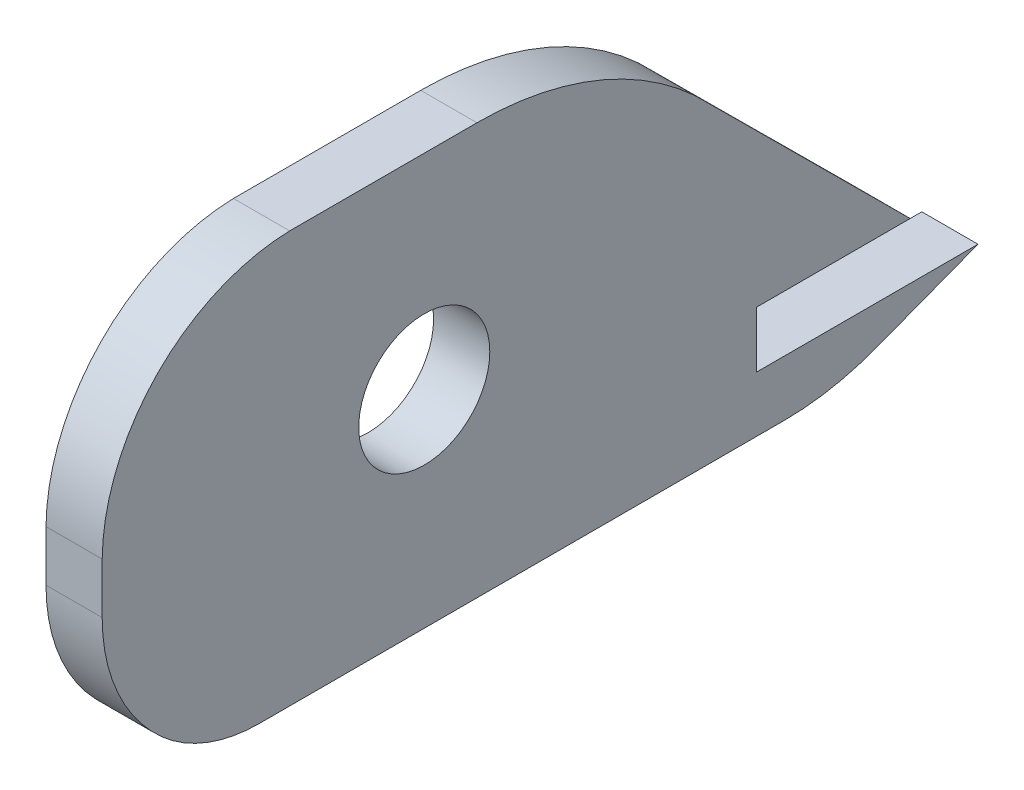
ISO-10303-21;
HEADER;
FILE_DESCRIPTION(('STEP AP214'),'2;1');
FILE_NAME('part.step','',(''),(''),'','','');
FILE_SCHEMA(('AUTOMOTIVE_DESIGN { 1 0 10303 214 1 1 1 1 }'));
ENDSEC;
DATA;
#1=APPLICATION_CONTEXT('core data for automotive mechanical design processes');
#2=APPLICATION_PROTOCOL_DEFINITION('international standard','automotive_design',2000,#1);
#3=PRODUCT_CONTEXT('',#1,'mechanical');
#4=PRODUCT('Part','Part','',(#3));
#5=PRODUCT_RELATED_PRODUCT_CATEGORY('part','',(#4));
#6=PRODUCT_DEFINITION_FORMATION('','',#4);
#7=PRODUCT_DEFINITION_CONTEXT('part definition',#1,'design');
#8=PRODUCT_DEFINITION('design','',#6,#7);
#9=PRODUCT_DEFINITION_SHAPE('','',#8);
#10=(LENGTH_UNIT() NAMED_UNIT(*) SI_UNIT(.MILLI.,.METRE.));
#11=(NAMED_UNIT(*) PLANE_ANGLE_UNIT() SI_UNIT($,.RADIAN.));
#12=(NAMED_UNIT(*) SI_UNIT($,.STERADIAN.) SOLID_ANGLE_UNIT());
#13=UNCERTAINTY_MEASURE_WITH_UNIT(LENGTH_MEASURE(1.E-05),#10,'distance_accuracy_value','');
#14=(GEOMETRIC_REPRESENTATION_CONTEXT(3) GLOBAL_UNCERTAINTY_ASSIGNED_CONTEXT((#13)) GLOBAL_UNIT_ASSIGNED_CONTEXT((#10,
#11,#12)) REPRESENTATION_CONTEXT('',''));
#15=CARTESIAN_POINT('',(0.,0.,0.));
#16=DIRECTION('',(0.,0.,1.));
#17=DIRECTION('',(1.,0.,0.));
#18=AXIS2_PLACEMENT_3D('',#15,#16,#17);
#19=CARTESIAN_POINT('',(6.84524580259062,3.,0.));
#20=DIRECTION('',(-1.,0.,0.));
#21=DIRECTION('',(0.,0.,1.));
#22=AXIS2_PLACEMENT_3D('',#19,#20,#21);
#23=PLANE('',#22);
#24=CARTESIAN_POINT('',(6.84524580259062,8.0684379519903,29.5682002991371));
#25=DIRECTION('',(-1.,0.,0.));
#26=DIRECTION('',(0.,0.,1.));
#27=AXIS2_PLACEMENT_3D('',#24,#25,#26);
#28=CIRCLE('',#27,3.5);
#29=CARTESIAN_POINT('',(6.84524580259062,8.0684379519903,33.0682002991371));
#30=VERTEX_POINT('',#29);
#31=EDGE_CURVE('E514',#30,#30,#28,.F.);
#32=ORIENTED_EDGE('',*,*,#31,.T.);
#33=EDGE_LOOP('',(#32));
#34=FACE_BOUND('',#33,.T.);
#35=DIRECTION('',(0.,1.,0.));
#36=VECTOR('',#35,1.);
#37=CARTESIAN_POINT('',(6.84524580259062,3.,11.8182002991371));
#38=LINE('',#37,#36);
#39=CARTESIAN_POINT('',(6.84524580259062,0.,11.8182002991371));
#40=VERTEX_POINT('',#39);
#41=CARTESIAN_POINT('',(6.84524580259062,3.,11.8182002991371));
#42=VERTEX_POINT('',#41);
#43=EDGE_CURVE('E189',#40,#42,#38,.T.);
#44=ORIENTED_EDGE('',*,*,#43,.F.);
#45=DIRECTION('',(0.,0.,1.));
#46=VECTOR('',#45,1.);
#47=CARTESIAN_POINT('',(6.84524580259062,0.,0.));
#48=LINE('',#47,#46);
#49=CARTESIAN_POINT('',(6.84524580259062,0.,0.));
#50=VERTEX_POINT('',#49);
#51=EDGE_CURVE('E377',#50,#40,#48,.T.);
#52=ORIENTED_EDGE('',*,*,#51,.F.);
#53=DIRECTION('',(0.,0.356127915394516,-0.93443721451832));
#54=VECTOR('',#53,1.);
#55=CARTESIAN_POINT('',(6.84524580259062,0.,0.));
#56=LINE('',#55,#54);
#57=CARTESIAN_POINT('',(6.84524580259062,-2.06615789435317,5.42135211561724));
#58=VERTEX_POINT('',#57);
#59=EDGE_CURVE('E298',#58,#50,#56,.T.);
#60=ORIENTED_EDGE('',*,*,#59,.F.);
#61=CARTESIAN_POINT('',(6.84524580259062,10.8976379940771,10.3620474706567));
#62=DIRECTION('',(1.,0.,0.));
#63=DIRECTION('',(0.,0.,1.));
#64=AXIS2_PLACEMENT_3D('',#61,#62,#63);
#65=CIRCLE('',#64,13.8733728569584);
#66=CARTESIAN_POINT('',(6.84524580259062,-2.9757348628813,10.3620474706567));
#67=VERTEX_POINT('',#66);
#68=EDGE_CURVE('E276',#67,#58,#65,.T.);
#69=ORIENTED_EDGE('',*,*,#68,.F.);
#70=DIRECTION('',(0.,0.,-1.));
#71=VECTOR('',#70,1.);
#72=CARTESIAN_POINT('',(6.84524580259062,-2.9757348628813,10.3620474706567));
#73=LINE('',#72,#71);
#74=CARTESIAN_POINT('',(6.84524580259062,-2.97573486288131,38.3620474706567));
#75=VERTEX_POINT('',#74);
#76=EDGE_CURVE('E281',#75,#67,#73,.T.);
#77=ORIENTED_EDGE('',*,*,#76,.F.);
#78=CARTESIAN_POINT('',(6.84524580259062,4.8597073591723,38.3620474706567));
#79=DIRECTION('',(1.,0.,0.));
#80=DIRECTION('',(0.,0.,1.));
#81=AXIS2_PLACEMENT_3D('',#78,#79,#80);
#82=CIRCLE('',#81,7.8354422220536);
#83=CARTESIAN_POINT('',(6.84524580259062,-1.01390135071814,43.5480744218246));
#84=VERTEX_POINT('',#83);
#85=EDGE_CURVE('E328',#84,#75,#82,.T.);
#86=ORIENTED_EDGE('',*,*,#85,.F.);
#87=CARTESIAN_POINT('',(6.84524580259062,6.11712297427611,37.2518285931603));
#88=DIRECTION('',(1.,0.,0.));
#89=DIRECTION('',(0.,0.,1.));
#90=AXIS2_PLACEMENT_3D('',#87,#88,#89);
#91=CIRCLE('',#90,9.51284497185947);
#92=CARTESIAN_POINT('',(6.84524580259062,6.11712297427611,46.7646735650198));
#93=VERTEX_POINT('',#92);
#94=EDGE_CURVE('E332',#93,#84,#91,.T.);
#95=ORIENTED_EDGE('',*,*,#94,.F.);
#96=DIRECTION('',(0.,-1.,0.));
#97=VECTOR('',#96,1.);
#98=CARTESIAN_POINT('',(6.84524580259062,6.11712297427611,46.7646735650198));
#99=LINE('',#98,#97);
#100=CARTESIAN_POINT('',(6.84524580259062,8.82475871142375,46.7646735650198));
#101=VERTEX_POINT('',#100);
#102=EDGE_CURVE('E336',#101,#93,#99,.T.);
#103=ORIENTED_EDGE('',*,*,#102,.F.);
#104=CARTESIAN_POINT('',(6.84524580259062,8.72229752394956,36.4896627417071));
#105=DIRECTION('',(1.,0.,0.));
#106=DIRECTION('',(0.,0.,-1.));
#107=AXIS2_PLACEMENT_3D('',#104,#105,#106);
#108=CIRCLE('',#107,10.275521676009);
#109=CARTESIAN_POINT('',(6.84524580259062,18.9943962825605,36.7548660740285));
#110=VERTEX_POINT('',#109);
#111=EDGE_CURVE('E340',#110,#101,#108,.T.);
#112=ORIENTED_EDGE('',*,*,#111,.F.);
#113=DIRECTION('',(0.,0.,1.));
#114=VECTOR('',#113,1.);
#115=CARTESIAN_POINT('',(6.84524580259062,18.9943962825605,36.7548660740285));
#116=LINE('',#115,#114);
#117=CARTESIAN_POINT('',(6.84524580259062,18.9943962825605,26.7548660740285));
#118=VERTEX_POINT('',#117);
#119=EDGE_CURVE('E344',#118,#110,#116,.T.);
#120=ORIENTED_EDGE('',*,*,#119,.F.);
#121=CARTESIAN_POINT('',(6.84524580259062,1.86707570076502,26.7548660740285));
#122=DIRECTION('',(1.,0.,0.));
#123=DIRECTION('',(0.,0.,1.));
#124=AXIS2_PLACEMENT_3D('',#121,#122,#123);
#125=CIRCLE('',#124,17.1273205817955);
#126=CARTESIAN_POINT('',(6.84524580259062,13.6377160838363,14.313116386625));
#127=VERTEX_POINT('',#126);
#128=EDGE_CURVE('E348',#127,#118,#125,.T.);
#129=ORIENTED_EDGE('',*,*,#128,.F.);
#130=DIRECTION('',(0.,0.70521888442068,0.708989650881063));
#131=VECTOR('',#130,1.);
#132=CARTESIAN_POINT('',(6.84524580259062,13.6377160838363,14.313116386625));
#133=LINE('',#132,#131);
#134=CARTESIAN_POINT('',(6.84524580259062,3.,3.61852102188716));
#135=VERTEX_POINT('',#134);
#136=EDGE_CURVE('E352',#135,#127,#133,.T.);
#137=ORIENTED_EDGE('',*,*,#136,.F.);
#138=DIRECTION('',(0.,0.,1.));
#139=VECTOR('',#138,1.);
#140=CARTESIAN_POINT('',(6.84524580259062,3.,0.));
#141=LINE('',#140,#139);
#142=EDGE_CURVE('E323',#135,#42,#141,.T.);
#143=ORIENTED_EDGE('',*,*,#142,.T.);
#144=EDGE_LOOP('',(#44,#52,#60,#69,#77,#86,#95,#103,#112,#120,#129,#137,#143));
#145=FACE_BOUND('',#144,.T.);
#146=ADVANCED_FACE('F174',(#34,#145),#23,.T.);
#147=CARTESIAN_POINT('',(9.84524580259062,3.,0.));
#148=DIRECTION('',(1.,0.,0.));
#149=DIRECTION('',(0.,0.,-1.));
#150=AXIS2_PLACEMENT_3D('',#147,#148,#149);
#151=PLANE('',#150);
#152=CARTESIAN_POINT('',(9.84524580259062,8.0684379519903,29.5682002991371));
#153=DIRECTION('',(1.,0.,0.));
#154=DIRECTION('',(0.,0.,-1.));
#155=AXIS2_PLACEMENT_3D('',#152,#153,#154);
#156=CIRCLE('',#155,3.5);
#157=CARTESIAN_POINT('',(9.84524580259062,8.0684379519903,26.0682002991371));
#158=VERTEX_POINT('',#157);
#159=EDGE_CURVE('E383',#158,#158,#156,.T.);
#160=ORIENTED_EDGE('',*,*,#159,.F.);
#161=EDGE_LOOP('',(#160));
#162=FACE_BOUND('',#161,.T.);
#163=DIRECTION('',(0.,-1.,0.));
#164=VECTOR('',#163,1.);
#165=CARTESIAN_POINT('',(9.84524580259062,3.,11.8182002991371));
#166=LINE('',#165,#164);
#167=CARTESIAN_POINT('',(9.84524580259063,3.,11.8182002991371));
#168=VERTEX_POINT('',#167);
#169=CARTESIAN_POINT('',(9.84524580259063,0.,11.8182002991371));
#170=VERTEX_POINT('',#169);
#171=EDGE_CURVE('E357',#168,#170,#166,.T.);
#172=ORIENTED_EDGE('',*,*,#171,.F.);
#173=DIRECTION('',(0.,0.,1.));
#174=VECTOR('',#173,1.);
#175=CARTESIAN_POINT('',(9.84524580259062,3.,0.));
#176=LINE('',#175,#174);
#177=CARTESIAN_POINT('',(9.84524580259062,3.,3.61852102188716));
#178=VERTEX_POINT('',#177);
#179=EDGE_CURVE('E182',#178,#168,#176,.T.);
#180=ORIENTED_EDGE('',*,*,#179,.F.);
#181=DIRECTION('',(0.,0.70521888442068,0.708989650881063));
#182=VECTOR('',#181,1.);
#183=CARTESIAN_POINT('',(9.84524580259062,13.6377160838363,14.313116386625));
#184=LINE('',#183,#182);
#185=CARTESIAN_POINT('',(9.84524580259062,13.6377160838363,14.313116386625));
#186=VERTEX_POINT('',#185);
#187=EDGE_CURVE('E320',#178,#186,#184,.T.);
#188=ORIENTED_EDGE('',*,*,#187,.T.);
#189=CARTESIAN_POINT('',(9.84524580259062,1.86707570076502,26.7548660740285));
#190=DIRECTION('',(1.,0.,0.));
#191=DIRECTION('',(0.,0.,1.));
#192=AXIS2_PLACEMENT_3D('',#189,#190,#191);
#193=CIRCLE('',#192,17.1273205817955);
#194=CARTESIAN_POINT('',(9.84524580259062,18.9943962825605,26.7548660740285));
#195=VERTEX_POINT('',#194);
#196=EDGE_CURVE('E317',#186,#195,#193,.T.);
#197=ORIENTED_EDGE('',*,*,#196,.T.);
#198=DIRECTION('',(0.,0.,1.));
#199=VECTOR('',#198,1.);
#200=CARTESIAN_POINT('',(9.84524580259062,18.9943962825605,36.7548660740285));
#201=LINE('',#200,#199);
#202=CARTESIAN_POINT('',(9.84524580259062,18.9943962825605,36.7548660740285));
#203=VERTEX_POINT('',#202);
#204=EDGE_CURVE('E314',#195,#203,#201,.T.);
#205=ORIENTED_EDGE('',*,*,#204,.T.);
#206=CARTESIAN_POINT('',(9.84524580259062,8.72229752394956,36.4896627417071));
#207=DIRECTION('',(1.,0.,0.));
#208=DIRECTION('',(0.,0.,-1.));
#209=AXIS2_PLACEMENT_3D('',#206,#207,#208);
#210=CIRCLE('',#209,10.275521676009);
#211=CARTESIAN_POINT('',(9.84524580259062,8.82475871142375,46.7646735650198));
#212=VERTEX_POINT('',#211);
#213=EDGE_CURVE('E311',#203,#212,#210,.T.);
#214=ORIENTED_EDGE('',*,*,#213,.T.);
#215=DIRECTION('',(0.,-1.,0.));
#216=VECTOR('',#215,1.);
#217=CARTESIAN_POINT('',(9.84524580259062,6.11712297427611,46.7646735650198));
#218=LINE('',#217,#216);
#219=CARTESIAN_POINT('',(9.84524580259062,6.11712297427611,46.7646735650198));
#220=VERTEX_POINT('',#219);
#221=EDGE_CURVE('E308',#212,#220,#218,.T.);
#222=ORIENTED_EDGE('',*,*,#221,.T.);
#223=CARTESIAN_POINT('',(9.84524580259062,6.11712297427611,37.2518285931603));
#224=DIRECTION('',(1.,0.,0.));
#225=DIRECTION('',(0.,0.,1.));
#226=AXIS2_PLACEMENT_3D('',#223,#224,#225);
#227=CIRCLE('',#226,9.51284497185947);
#228=CARTESIAN_POINT('',(9.84524580259062,-1.01390135071814,43.5480744218246));
#229=VERTEX_POINT('',#228);
#230=EDGE_CURVE('E305',#220,#229,#227,.T.);
#231=ORIENTED_EDGE('',*,*,#230,.T.);
#232=CARTESIAN_POINT('',(9.84524580259062,4.8597073591723,38.3620474706567));
#233=DIRECTION('',(1.,0.,0.));
#234=DIRECTION('',(0.,0.,1.));
#235=AXIS2_PLACEMENT_3D('',#232,#233,#234);
#236=CIRCLE('',#235,7.8354422220536);
#237=CARTESIAN_POINT('',(9.84524580259062,-2.97573486288131,38.3620474706567));
#238=VERTEX_POINT('',#237);
#239=EDGE_CURVE('E303',#229,#238,#236,.T.);
#240=ORIENTED_EDGE('',*,*,#239,.T.);
#241=DIRECTION('',(0.,0.,-1.));
#242=VECTOR('',#241,1.);
#243=CARTESIAN_POINT('',(9.84524580259062,-2.9757348628813,10.3620474706567));
#244=LINE('',#243,#242);
#245=CARTESIAN_POINT('',(9.84524580259062,-2.9757348628813,10.3620474706567));
#246=VERTEX_POINT('',#245);
#247=EDGE_CURVE('E291',#238,#246,#244,.T.);
#248=ORIENTED_EDGE('',*,*,#247,.T.);
#249=CARTESIAN_POINT('',(9.84524580259062,10.8976379940771,10.3620474706567));
#250=DIRECTION('',(1.,0.,0.));
#251=DIRECTION('',(0.,0.,1.));
#252=AXIS2_PLACEMENT_3D('',#249,#250,#251);
#253=CIRCLE('',#252,13.8733728569584);
#254=CARTESIAN_POINT('',(9.84524580259062,-2.06615789435317,5.42135211561724));
#255=VERTEX_POINT('',#254);
#256=EDGE_CURVE('E273',#246,#255,#253,.T.);
#257=ORIENTED_EDGE('',*,*,#256,.T.);
#258=DIRECTION('',(0.,0.356127915394516,-0.93443721451832));
#259=VECTOR('',#258,1.);
#260=CARTESIAN_POINT('',(9.84524580259062,0.,0.));
#261=LINE('',#260,#259);
#262=CARTESIAN_POINT('',(9.84524580259062,0.,0.));
#263=VERTEX_POINT('',#262);
#264=EDGE_CURVE('E288',#255,#263,#261,.T.);
#265=ORIENTED_EDGE('',*,*,#264,.T.);
#266=DIRECTION('',(0.,0.,1.));
#267=VECTOR('',#266,1.);
#268=CARTESIAN_POINT('',(9.84524580259062,0.,0.));
#269=LINE('',#268,#267);
#270=EDGE_CURVE('E296',#263,#170,#269,.T.);
#271=ORIENTED_EDGE('',*,*,#270,.T.);
#272=EDGE_LOOP('',(#172,#180,#188,#197,#205,#214,#222,#231,#240,#248,#257,#265,#271));
#273=FACE_BOUND('',#272,.T.);
#274=ADVANCED_FACE('F286',(#162,#273),#151,.T.);
#275=CARTESIAN_POINT('',(6.84524580259062,0.,0.));
#276=DIRECTION('',(0.,-0.93443721451832,-0.356127915394516));
#277=DIRECTION('',(0.,0.356127915394516,-0.93443721451832));
#278=AXIS2_PLACEMENT_3D('',#275,#276,#277);
#279=PLANE('',#278);
#280=ORIENTED_EDGE('',*,*,#264,.F.);
#281=DIRECTION('',(1.,0.,0.));
#282=VECTOR('',#281,1.);
#283=CARTESIAN_POINT('',(6.84524580259062,-2.06615789435317,5.42135211561724));
#284=LINE('',#283,#282);
#285=EDGE_CURVE('E269',#58,#255,#284,.T.);
#286=ORIENTED_EDGE('',*,*,#285,.F.);
#287=ORIENTED_EDGE('',*,*,#59,.T.);
#288=DIRECTION('',(1.,0.,0.));
#289=VECTOR('',#288,1.);
#290=CARTESIAN_POINT('',(6.84524580259062,0.,0.));
#291=LINE('',#290,#289);
#292=EDGE_CURVE('E295',#50,#263,#291,.T.);
#293=ORIENTED_EDGE('',*,*,#292,.T.);
#294=EDGE_LOOP('',(#280,#286,#287,#293));
#295=FACE_BOUND('',#294,.T.);
#296=ADVANCED_FACE('F294',(#295),#279,.T.);
#297=CARTESIAN_POINT('',(6.84524580259062,10.8976379940771,10.3620474706567));
#298=DIRECTION('',(1.,0.,0.));
#299=DIRECTION('',(0.,0.,-1.));
#300=AXIS2_PLACEMENT_3D('',#297,#298,#299);
#301=CYLINDRICAL_SURFACE('',#300,13.8733728569584);
#302=ORIENTED_EDGE('',*,*,#256,.F.);
#303=DIRECTION('',(1.,0.,0.));
#304=VECTOR('',#303,1.);
#305=CARTESIAN_POINT('',(6.84524580259062,-2.9757348628813,10.3620474706567));
#306=LINE('',#305,#304);
#307=EDGE_CURVE('E327',#67,#246,#306,.T.);
#308=ORIENTED_EDGE('',*,*,#307,.F.);
#309=ORIENTED_EDGE('',*,*,#68,.T.);
#310=ORIENTED_EDGE('',*,*,#285,.T.);
#311=EDGE_LOOP('',(#302,#308,#309,#310));
#312=FACE_BOUND('',#311,.T.);
#313=ADVANCED_FACE('F271',(#312),#301,.T.);
#314=CARTESIAN_POINT('',(6.84524580259062,-2.9757348628813,10.3620474706567));
#315=DIRECTION('',(0.,-1.,0.));
#316=DIRECTION('',(0.,0.,-1.));
#317=AXIS2_PLACEMENT_3D('',#314,#315,#316);
#318=PLANE('',#317);
#319=ORIENTED_EDGE('',*,*,#247,.F.);
#320=DIRECTION('',(1.,0.,0.));
#321=VECTOR('',#320,1.);
#322=CARTESIAN_POINT('',(6.84524580259062,-2.97573486288131,38.3620474706567));
#323=LINE('',#322,#321);
#324=EDGE_CURVE('E331',#75,#238,#323,.T.);
#325=ORIENTED_EDGE('',*,*,#324,.F.);
#326=ORIENTED_EDGE('',*,*,#76,.T.);
#327=ORIENTED_EDGE('',*,*,#307,.T.);
#328=EDGE_LOOP('',(#319,#325,#326,#327));
#329=FACE_BOUND('',#328,.T.);
#330=ADVANCED_FACE('F374',(#329),#318,.T.);
#331=CARTESIAN_POINT('',(6.84524580259062,4.8597073591723,38.3620474706567));
#332=DIRECTION('',(1.,0.,0.));
#333=DIRECTION('',(0.,0.,-1.));
#334=AXIS2_PLACEMENT_3D('',#331,#332,#333);
#335=CYLINDRICAL_SURFACE('',#334,7.8354422220536);
#336=ORIENTED_EDGE('',*,*,#239,.F.);
#337=DIRECTION('',(1.,0.,0.));
#338=VECTOR('',#337,1.);
#339=CARTESIAN_POINT('',(6.84524580259062,-1.01390135071814,43.5480744218246));
#340=LINE('',#339,#338);
#341=EDGE_CURVE('E335',#84,#229,#340,.T.);
#342=ORIENTED_EDGE('',*,*,#341,.F.);
#343=ORIENTED_EDGE('',*,*,#85,.T.);
#344=ORIENTED_EDGE('',*,*,#324,.T.);
#345=EDGE_LOOP('',(#336,#342,#343,#344));
#346=FACE_BOUND('',#345,.T.);
#347=ADVANCED_FACE('F431',(#346),#335,.T.);
#348=CARTESIAN_POINT('',(6.84524580259062,6.11712297427611,37.2518285931603));
#349=DIRECTION('',(1.,0.,0.));
#350=DIRECTION('',(0.,0.,-1.));
#351=AXIS2_PLACEMENT_3D('',#348,#349,#350);
#352=CYLINDRICAL_SURFACE('',#351,9.51284497185947);
#353=ORIENTED_EDGE('',*,*,#230,.F.);
#354=DIRECTION('',(1.,0.,0.));
#355=VECTOR('',#354,1.);
#356=CARTESIAN_POINT('',(6.84524580259062,6.11712297427611,46.7646735650198));
#357=LINE('',#356,#355);
#358=EDGE_CURVE('E339',#93,#220,#357,.T.);
#359=ORIENTED_EDGE('',*,*,#358,.F.);
#360=ORIENTED_EDGE('',*,*,#94,.T.);
#361=ORIENTED_EDGE('',*,*,#341,.T.);
#362=EDGE_LOOP('',(#353,#359,#360,#361));
#363=FACE_BOUND('',#362,.T.);
#364=ADVANCED_FACE('F427',(#363),#352,.T.);
#365=CARTESIAN_POINT('',(6.84524580259062,6.11712297427611,46.7646735650198));
#366=DIRECTION('',(0.,0.,1.));
#367=DIRECTION('',(1.,0.,0.));
#368=AXIS2_PLACEMENT_3D('',#365,#366,#367);
#369=PLANE('',#368);
#370=ORIENTED_EDGE('',*,*,#221,.F.);
#371=DIRECTION('',(1.,0.,0.));
#372=VECTOR('',#371,1.);
#373=CARTESIAN_POINT('',(6.84524580259062,8.82475871142375,46.7646735650198));
#374=LINE('',#373,#372);
#375=EDGE_CURVE('E343',#101,#212,#374,.T.);
#376=ORIENTED_EDGE('',*,*,#375,.F.);
#377=ORIENTED_EDGE('',*,*,#102,.T.);
#378=ORIENTED_EDGE('',*,*,#358,.T.);
#379=EDGE_LOOP('',(#370,#376,#377,#378));
#380=FACE_BOUND('',#379,.T.);
#381=ADVANCED_FACE('F423',(#380),#369,.T.);
#382=CARTESIAN_POINT('',(6.84524580259062,8.72229752394956,36.4896627417071));
#383=DIRECTION('',(1.,0.,0.));
#384=DIRECTION('',(0.,0.,-1.));
#385=AXIS2_PLACEMENT_3D('',#382,#383,#384);
#386=CYLINDRICAL_SURFACE('',#385,10.275521676009);
#387=ORIENTED_EDGE('',*,*,#213,.F.);
#388=DIRECTION('',(1.,0.,0.));
#389=VECTOR('',#388,1.);
#390=CARTESIAN_POINT('',(6.84524580259062,18.9943962825605,36.7548660740285));
#391=LINE('',#390,#389);
#392=EDGE_CURVE('E347',#110,#203,#391,.T.);
#393=ORIENTED_EDGE('',*,*,#392,.F.);
#394=ORIENTED_EDGE('',*,*,#111,.T.);
#395=ORIENTED_EDGE('',*,*,#375,.T.);
#396=EDGE_LOOP('',(#387,#393,#394,#395));
#397=FACE_BOUND('',#396,.T.);
#398=ADVANCED_FACE('F419',(#397),#386,.T.);
#399=CARTESIAN_POINT('',(6.84524580259062,18.9943962825605,36.7548660740285));
#400=DIRECTION('',(0.,1.,0.));
#401=DIRECTION('',(0.,0.,1.));
#402=AXIS2_PLACEMENT_3D('',#399,#400,#401);
#403=PLANE('',#402);
#404=ORIENTED_EDGE('',*,*,#204,.F.);
#405=DIRECTION('',(1.,0.,0.));
#406=VECTOR('',#405,1.);
#407=CARTESIAN_POINT('',(6.84524580259062,18.9943962825605,26.7548660740285));
#408=LINE('',#407,#406);
#409=EDGE_CURVE('E351',#118,#195,#408,.T.);
#410=ORIENTED_EDGE('',*,*,#409,.F.);
#411=ORIENTED_EDGE('',*,*,#119,.T.);
#412=ORIENTED_EDGE('',*,*,#392,.T.);
#413=EDGE_LOOP('',(#404,#410,#411,#412));
#414=FACE_BOUND('',#413,.T.);
#415=ADVANCED_FACE('F415',(#414),#403,.T.);
#416=CARTESIAN_POINT('',(6.84524580259062,1.86707570076502,26.7548660740285));
#417=DIRECTION('',(1.,0.,0.));
#418=DIRECTION('',(0.,0.,-1.));
#419=AXIS2_PLACEMENT_3D('',#416,#417,#418);
#420=CYLINDRICAL_SURFACE('',#419,17.1273205817955);
#421=ORIENTED_EDGE('',*,*,#196,.F.);
#422=DIRECTION('',(1.,0.,0.));
#423=VECTOR('',#422,1.);
#424=CARTESIAN_POINT('',(6.84524580259062,13.6377160838363,14.313116386625));
#425=LINE('',#424,#423);
#426=EDGE_CURVE('E354',#127,#186,#425,.T.);
#427=ORIENTED_EDGE('',*,*,#426,.F.);
#428=ORIENTED_EDGE('',*,*,#128,.T.);
#429=ORIENTED_EDGE('',*,*,#409,.T.);
#430=EDGE_LOOP('',(#421,#427,#428,#429));
#431=FACE_BOUND('',#430,.T.);
#432=ADVANCED_FACE('F412',(#431),#420,.T.);
#433=CARTESIAN_POINT('',(6.84524580259062,13.6377160838363,14.313116386625));
#434=DIRECTION('',(0.,0.708989650881063,-0.70521888442068));
#435=DIRECTION('',(0.,0.70521888442068,0.708989650881063));
#436=AXIS2_PLACEMENT_3D('',#433,#434,#435);
#437=PLANE('',#436);
#438=ORIENTED_EDGE('',*,*,#187,.F.);
#439=DIRECTION('',(1.,0.,0.));
#440=VECTOR('',#439,1.);
#441=CARTESIAN_POINT('',(6.84524580259062,3.,3.61852102188716));
#442=LINE('',#441,#440);
#443=EDGE_CURVE('E365',#135,#178,#442,.T.);
#444=ORIENTED_EDGE('',*,*,#443,.F.);
#445=ORIENTED_EDGE('',*,*,#136,.T.);
#446=ORIENTED_EDGE('',*,*,#426,.T.);
#447=EDGE_LOOP('',(#438,#444,#445,#446));
#448=FACE_BOUND('',#447,.T.);
#449=ADVANCED_FACE('F396',(#448),#437,.T.);
#450=CARTESIAN_POINT('',(26.8452458025906,3.,11.8182002991371));
#451=DIRECTION('',(0.,0.,1.));
#452=DIRECTION('',(1.,0.,0.));
#453=AXIS2_PLACEMENT_3D('',#450,#451,#452);
#454=PLANE('',#453);
#455=DIRECTION('',(-1.,0.,0.));
#456=VECTOR('',#455,1.);
#457=CARTESIAN_POINT('',(26.8452458025906,0.,11.8182002991371));
#458=LINE('',#457,#456);
#459=EDGE_CURVE('E355',#170,#40,#458,.T.);
#460=ORIENTED_EDGE('',*,*,#459,.T.);
#461=ORIENTED_EDGE('',*,*,#43,.T.);
#462=DIRECTION('',(-1.,0.,0.));
#463=VECTOR('',#462,1.);
#464=CARTESIAN_POINT('',(26.8452458025906,3.,11.8182002991371));
#465=LINE('',#464,#463);
#466=EDGE_CURVE('E12',#168,#42,#465,.T.);
#467=ORIENTED_EDGE('',*,*,#466,.F.);
#468=ORIENTED_EDGE('',*,*,#171,.T.);
#469=EDGE_LOOP('',(#460,#461,#467,#468));
#470=FACE_BOUND('',#469,.T.);
#471=ADVANCED_FACE('F176',(#470),#454,.F.);
#472=CARTESIAN_POINT('',(26.8452458025906,0.,11.8182002991371));
#473=DIRECTION('',(0.,-1.,0.));
#474=DIRECTION('',(0.,0.,-1.));
#475=AXIS2_PLACEMENT_3D('',#472,#473,#474);
#476=PLANE('',#475);
#477=ORIENTED_EDGE('',*,*,#51,.T.);
#478=ORIENTED_EDGE('',*,*,#459,.F.);
#479=ORIENTED_EDGE('',*,*,#270,.F.);
#480=ORIENTED_EDGE('',*,*,#292,.F.);
#481=EDGE_LOOP('',(#477,#478,#479,#480));
#482=FACE_BOUND('',#481,.T.);
#483=ADVANCED_FACE('F388',(#482),#476,.F.);
#484=CARTESIAN_POINT('',(26.8452458025906,3.,11.8182002991371));
#485=DIRECTION('',(0.,1.,0.));
#486=DIRECTION('',(0.,0.,1.));
#487=AXIS2_PLACEMENT_3D('',#484,#485,#486);
#488=PLANE('',#487);
#489=ORIENTED_EDGE('',*,*,#142,.F.);
#490=ORIENTED_EDGE('',*,*,#443,.T.);
#491=ORIENTED_EDGE('',*,*,#179,.T.);
#492=ORIENTED_EDGE('',*,*,#466,.T.);
#493=EDGE_LOOP('',(#489,#490,#491,#492));
#494=FACE_BOUND('',#493,.T.);
#495=ADVANCED_FACE('F386',(#494),#488,.F.);
#496=CARTESIAN_POINT('',(-3.05424913402105,8.0684379519903,29.5682002991371));
#497=DIRECTION('',(1.,0.,0.));
#498=DIRECTION('',(0.,0.,-1.));
#499=AXIS2_PLACEMENT_3D('',#496,#497,#498);
#500=CYLINDRICAL_SURFACE('',#499,3.5);
#501=ORIENTED_EDGE('',*,*,#159,.T.);
#502=EDGE_LOOP('',(#501));
#503=FACE_BOUND('',#502,.T.);
#504=ORIENTED_EDGE('',*,*,#31,.F.);
#505=EDGE_LOOP('',(#504));
#506=FACE_BOUND('',#505,.T.);
#507=ADVANCED_FACE('F395',(#503,#506),#500,.F.);
#508=CLOSED_SHELL('',(#146,#274,#296,#313,#330,#347,#364,#381,#398,#415,#432,#449,#471,#483,
#495,#507));
#509=MANIFOLD_SOLID_BREP('B2',#508);
#510=ADVANCED_BREP_SHAPE_REPRESENTATION('',(#18,#509),#14);
#511=SHAPE_DEFINITION_REPRESENTATION(#9,#510);
ENDSEC;
END-ISO-10303-21;
